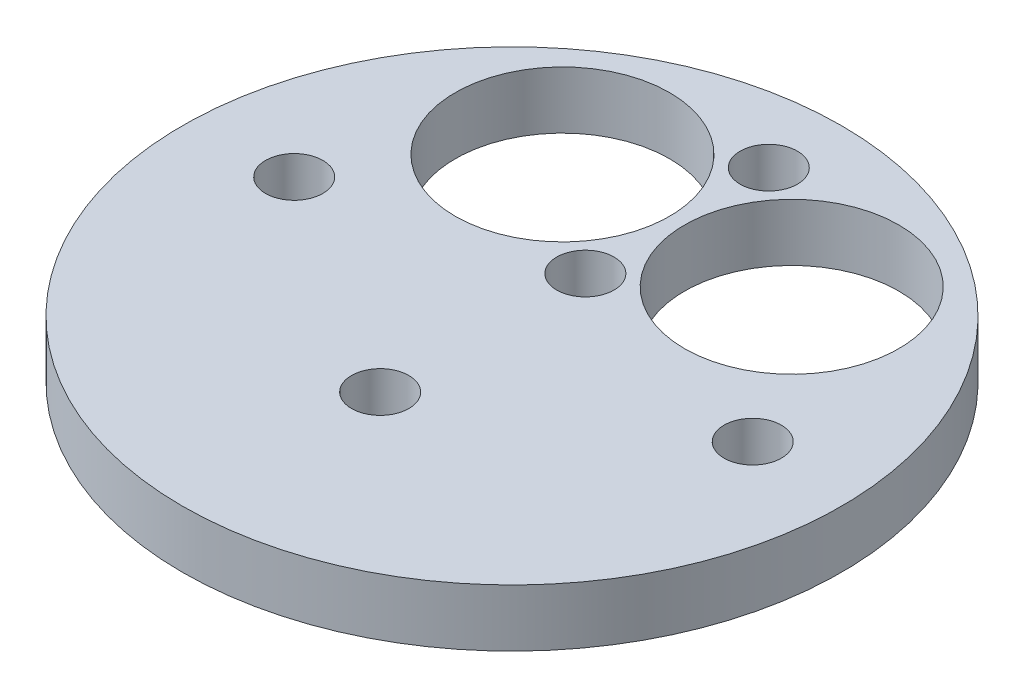
ISO-10303-21;
HEADER;
FILE_DESCRIPTION(('STEP AP214'),'2;1');
FILE_NAME('part.step','',(''),(''),'','','');
FILE_SCHEMA(('AUTOMOTIVE_DESIGN { 1 0 10303 214 1 1 1 1 }'));
ENDSEC;
DATA;
#1=APPLICATION_CONTEXT('core data for automotive mechanical design processes');
#2=APPLICATION_PROTOCOL_DEFINITION('international standard','automotive_design',2000,#1);
#3=PRODUCT_CONTEXT('',#1,'mechanical');
#4=PRODUCT('Part','Part','',(#3));
#5=PRODUCT_RELATED_PRODUCT_CATEGORY('part','',(#4));
#6=PRODUCT_DEFINITION_FORMATION('','',#4);
#7=PRODUCT_DEFINITION_CONTEXT('part definition',#1,'design');
#8=PRODUCT_DEFINITION('design','',#6,#7);
#9=PRODUCT_DEFINITION_SHAPE('','',#8);
#10=(LENGTH_UNIT() NAMED_UNIT(*) SI_UNIT(.MILLI.,.METRE.));
#11=(NAMED_UNIT(*) PLANE_ANGLE_UNIT() SI_UNIT($,.RADIAN.));
#12=(NAMED_UNIT(*) SI_UNIT($,.STERADIAN.) SOLID_ANGLE_UNIT());
#13=UNCERTAINTY_MEASURE_WITH_UNIT(LENGTH_MEASURE(1.E-05),#10,'distance_accuracy_value','');
#14=(GEOMETRIC_REPRESENTATION_CONTEXT(3) GLOBAL_UNCERTAINTY_ASSIGNED_CONTEXT((#13)) GLOBAL_UNIT_ASSIGNED_CONTEXT((#10,
#11,#12)) REPRESENTATION_CONTEXT('',''));
#15=CARTESIAN_POINT('',(0.,0.,0.));
#16=DIRECTION('',(0.,0.,1.));
#17=DIRECTION('',(1.,0.,0.));
#18=AXIS2_PLACEMENT_3D('',#15,#16,#17);
#19=CARTESIAN_POINT('',(0.,0.,0.));
#20=DIRECTION('',(0.,-1.,0.));
#21=DIRECTION('',(0.,0.,-1.));
#22=AXIS2_PLACEMENT_3D('',#19,#20,#21);
#23=PLANE('',#22);
#24=CARTESIAN_POINT('',(-25.4,0.,-1.27));
#25=DIRECTION('',(0.,1.,0.));
#26=DIRECTION('',(0.,0.,1.));
#27=AXIS2_PLACEMENT_3D('',#24,#25,#26);
#28=CIRCLE('',#27,3.175);
#29=CARTESIAN_POINT('',(-25.4,0.,1.905));
#30=VERTEX_POINT('',#29);
#31=EDGE_CURVE('E119',#30,#30,#28,.T.);
#32=ORIENTED_EDGE('',*,*,#31,.T.);
#33=EDGE_LOOP('',(#32));
#34=FACE_BOUND('',#33,.T.);
#35=CARTESIAN_POINT('',(25.4,0.,-1.27));
#36=DIRECTION('',(0.,1.,0.));
#37=DIRECTION('',(0.,0.,1.));
#38=AXIS2_PLACEMENT_3D('',#35,#36,#37);
#39=CIRCLE('',#38,3.175);
#40=CARTESIAN_POINT('',(25.4,0.,1.905));
#41=VERTEX_POINT('',#40);
#42=EDGE_CURVE('E123',#41,#41,#39,.T.);
#43=ORIENTED_EDGE('',*,*,#42,.T.);
#44=EDGE_LOOP('',(#43));
#45=FACE_BOUND('',#44,.T.);
#46=CARTESIAN_POINT('',(0.,0.,-28.448));
#47=DIRECTION('',(0.,1.,0.));
#48=DIRECTION('',(0.,0.,1.));
#49=AXIS2_PLACEMENT_3D('',#46,#47,#48);
#50=CIRCLE('',#49,3.175);
#51=CARTESIAN_POINT('',(0.,0.,-25.273));
#52=VERTEX_POINT('',#51);
#53=EDGE_CURVE('E136',#52,#52,#50,.T.);
#54=ORIENTED_EDGE('',*,*,#53,.T.);
#55=EDGE_LOOP('',(#54));
#56=FACE_BOUND('',#55,.T.);
#57=CARTESIAN_POINT('',(12.7,0.,-18.288));
#58=DIRECTION('',(0.,1.,0.));
#59=DIRECTION('',(0.,0.,1.));
#60=AXIS2_PLACEMENT_3D('',#57,#58,#59);
#61=CIRCLE('',#60,11.8745);
#62=CARTESIAN_POINT('',(12.7,0.,-6.4135));
#63=VERTEX_POINT('',#62);
#64=EDGE_CURVE('E141',#63,#63,#61,.T.);
#65=ORIENTED_EDGE('',*,*,#64,.T.);
#66=EDGE_LOOP('',(#65));
#67=FACE_BOUND('',#66,.T.);
#68=CARTESIAN_POINT('',(0.,0.,-8.128));
#69=DIRECTION('',(0.,1.,0.));
#70=DIRECTION('',(0.,0.,1.));
#71=AXIS2_PLACEMENT_3D('',#68,#69,#70);
#72=CIRCLE('',#71,3.175);
#73=CARTESIAN_POINT('',(0.,0.,-4.953));
#74=VERTEX_POINT('',#73);
#75=EDGE_CURVE('E133',#74,#74,#72,.T.);
#76=ORIENTED_EDGE('',*,*,#75,.T.);
#77=EDGE_LOOP('',(#76));
#78=FACE_BOUND('',#77,.T.);
#79=CARTESIAN_POINT('',(0.,0.,14.605));
#80=DIRECTION('',(0.,1.,0.));
#81=DIRECTION('',(0.,0.,1.));
#82=AXIS2_PLACEMENT_3D('',#79,#80,#81);
#83=CIRCLE('',#82,3.175);
#84=CARTESIAN_POINT('',(0.,0.,17.78));
#85=VERTEX_POINT('',#84);
#86=EDGE_CURVE('E125',#85,#85,#83,.T.);
#87=ORIENTED_EDGE('',*,*,#86,.T.);
#88=EDGE_LOOP('',(#87));
#89=FACE_BOUND('',#88,.T.);
#90=CARTESIAN_POINT('',(-12.7,0.,-18.288));
#91=DIRECTION('',(0.,1.,0.));
#92=DIRECTION('',(0.,0.,1.));
#93=AXIS2_PLACEMENT_3D('',#90,#91,#92);
#94=CIRCLE('',#93,11.8745);
#95=CARTESIAN_POINT('',(-12.7,0.,-6.4135));
#96=VERTEX_POINT('',#95);
#97=EDGE_CURVE('E53',#96,#96,#94,.T.);
#98=ORIENTED_EDGE('',*,*,#97,.T.);
#99=EDGE_LOOP('',(#98));
#100=FACE_BOUND('',#99,.T.);
#101=CARTESIAN_POINT('',(0.,0.,0.));
#102=DIRECTION('',(0.,-1.,0.));
#103=DIRECTION('',(0.,0.,-1.));
#104=AXIS2_PLACEMENT_3D('',#101,#102,#103);
#105=CIRCLE('',#104,36.5125);
#106=CARTESIAN_POINT('',(0.,0.,-36.5125));
#107=VERTEX_POINT('',#106);
#108=EDGE_CURVE('E10',#107,#107,#105,.T.);
#109=ORIENTED_EDGE('',*,*,#108,.T.);
#110=EDGE_LOOP('',(#109));
#111=FACE_BOUND('',#110,.T.);
#112=ADVANCED_FACE('F34',(#34,#45,#56,#67,#78,#89,#100,#111),#23,.T.);
#113=CARTESIAN_POINT('',(0.,0.,0.));
#114=DIRECTION('',(0.,-1.,0.));
#115=DIRECTION('',(0.,0.,-1.));
#116=AXIS2_PLACEMENT_3D('',#113,#114,#115);
#117=CYLINDRICAL_SURFACE('',#116,36.5125);
#118=CARTESIAN_POINT('',(0.,6.35,0.));
#119=DIRECTION('',(0.,-1.,0.));
#120=DIRECTION('',(0.,0.,-1.));
#121=AXIS2_PLACEMENT_3D('',#118,#119,#120);
#122=CIRCLE('',#121,36.5125);
#123=CARTESIAN_POINT('',(0.,6.35,-36.5125));
#124=VERTEX_POINT('',#123);
#125=EDGE_CURVE('E41',#124,#124,#122,.T.);
#126=ORIENTED_EDGE('',*,*,#125,.T.);
#127=EDGE_LOOP('',(#126));
#128=FACE_BOUND('',#127,.T.);
#129=ORIENTED_EDGE('',*,*,#108,.F.);
#130=EDGE_LOOP('',(#129));
#131=FACE_BOUND('',#130,.T.);
#132=ADVANCED_FACE('F72',(#128,#131),#117,.T.);
#133=CARTESIAN_POINT('',(36.5125,6.35,0.));
#134=DIRECTION('',(0.,1.,0.));
#135=DIRECTION('',(0.,0.,1.));
#136=AXIS2_PLACEMENT_3D('',#133,#134,#135);
#137=PLANE('',#136);
#138=CARTESIAN_POINT('',(-25.4,6.35,-1.27));
#139=DIRECTION('',(0.,1.,0.));
#140=DIRECTION('',(0.,0.,1.));
#141=AXIS2_PLACEMENT_3D('',#138,#139,#140);
#142=CIRCLE('',#141,3.175);
#143=CARTESIAN_POINT('',(-25.4,6.35,1.905));
#144=VERTEX_POINT('',#143);
#145=EDGE_CURVE('E122',#144,#144,#142,.T.);
#146=ORIENTED_EDGE('',*,*,#145,.F.);
#147=EDGE_LOOP('',(#146));
#148=FACE_BOUND('',#147,.T.);
#149=CARTESIAN_POINT('',(25.4,6.35,-1.27));
#150=DIRECTION('',(0.,1.,0.));
#151=DIRECTION('',(0.,0.,1.));
#152=AXIS2_PLACEMENT_3D('',#149,#150,#151);
#153=CIRCLE('',#152,3.175);
#154=CARTESIAN_POINT('',(25.4,6.35,1.905));
#155=VERTEX_POINT('',#154);
#156=EDGE_CURVE('E128',#155,#155,#153,.T.);
#157=ORIENTED_EDGE('',*,*,#156,.F.);
#158=EDGE_LOOP('',(#157));
#159=FACE_BOUND('',#158,.T.);
#160=CARTESIAN_POINT('',(0.,6.35,-28.448));
#161=DIRECTION('',(0.,1.,0.));
#162=DIRECTION('',(0.,0.,1.));
#163=AXIS2_PLACEMENT_3D('',#160,#161,#162);
#164=CIRCLE('',#163,3.175);
#165=CARTESIAN_POINT('',(0.,6.35,-25.273));
#166=VERTEX_POINT('',#165);
#167=EDGE_CURVE('E37',#166,#166,#164,.T.);
#168=ORIENTED_EDGE('',*,*,#167,.F.);
#169=EDGE_LOOP('',(#168));
#170=FACE_BOUND('',#169,.T.);
#171=CARTESIAN_POINT('',(12.7,6.35,-18.288));
#172=DIRECTION('',(0.,1.,0.));
#173=DIRECTION('',(0.,0.,1.));
#174=AXIS2_PLACEMENT_3D('',#171,#172,#173);
#175=CIRCLE('',#174,11.8745);
#176=CARTESIAN_POINT('',(12.7,6.35,-6.4135));
#177=VERTEX_POINT('',#176);
#178=EDGE_CURVE('E58',#177,#177,#175,.T.);
#179=ORIENTED_EDGE('',*,*,#178,.F.);
#180=EDGE_LOOP('',(#179));
#181=FACE_BOUND('',#180,.T.);
#182=CARTESIAN_POINT('',(0.,6.35,-8.128));
#183=DIRECTION('',(0.,1.,0.));
#184=DIRECTION('',(0.,0.,1.));
#185=AXIS2_PLACEMENT_3D('',#182,#183,#184);
#186=CIRCLE('',#185,3.175);
#187=CARTESIAN_POINT('',(0.,6.35,-4.953));
#188=VERTEX_POINT('',#187);
#189=EDGE_CURVE('E56',#188,#188,#186,.T.);
#190=ORIENTED_EDGE('',*,*,#189,.F.);
#191=EDGE_LOOP('',(#190));
#192=FACE_BOUND('',#191,.T.);
#193=CARTESIAN_POINT('',(0.,6.35,14.605));
#194=DIRECTION('',(0.,1.,0.));
#195=DIRECTION('',(0.,0.,1.));
#196=AXIS2_PLACEMENT_3D('',#193,#194,#195);
#197=CIRCLE('',#196,3.175);
#198=CARTESIAN_POINT('',(0.,6.35,17.78));
#199=VERTEX_POINT('',#198);
#200=EDGE_CURVE('E52',#199,#199,#197,.T.);
#201=ORIENTED_EDGE('',*,*,#200,.F.);
#202=EDGE_LOOP('',(#201));
#203=FACE_BOUND('',#202,.T.);
#204=CARTESIAN_POINT('',(-12.7,6.35,-18.288));
#205=DIRECTION('',(0.,1.,0.));
#206=DIRECTION('',(0.,0.,1.));
#207=AXIS2_PLACEMENT_3D('',#204,#205,#206);
#208=CIRCLE('',#207,11.8745);
#209=CARTESIAN_POINT('',(-12.7,6.35,-6.4135));
#210=VERTEX_POINT('',#209);
#211=EDGE_CURVE('E49',#210,#210,#208,.T.);
#212=ORIENTED_EDGE('',*,*,#211,.F.);
#213=EDGE_LOOP('',(#212));
#214=FACE_BOUND('',#213,.T.);
#215=ORIENTED_EDGE('',*,*,#125,.F.);
#216=EDGE_LOOP('',(#215));
#217=FACE_BOUND('',#216,.T.);
#218=ADVANCED_FACE('F68',(#148,#159,#170,#181,#192,#203,#214,#217),#137,.T.);
#219=CARTESIAN_POINT('',(-12.7,0.,-18.288));
#220=DIRECTION('',(0.,1.,0.));
#221=DIRECTION('',(0.,0.,1.));
#222=AXIS2_PLACEMENT_3D('',#219,#220,#221);
#223=CYLINDRICAL_SURFACE('',#222,11.8745);
#224=CARTESIAN_POINT('',(-12.7,6.35,-6.4135));
#225=CARTESIAN_POINT('',(-12.7,6.28385416666666,-6.4135));
#226=CARTESIAN_POINT('',(-12.7,6.21770833333333,-6.4135));
#227=CARTESIAN_POINT('',(-12.7,6.08541666666666,-6.4135));
#228=CARTESIAN_POINT('',(-12.7,6.01927083333333,-6.4135));
#229=CARTESIAN_POINT('',(-12.7,5.88697916666666,-6.4135));
#230=CARTESIAN_POINT('',(-12.7,5.82083333333333,-6.4135));
#231=CARTESIAN_POINT('',(-12.7,5.68854166666666,-6.4135));
#232=CARTESIAN_POINT('',(-12.7,5.62239583333333,-6.4135));
#233=CARTESIAN_POINT('',(-12.7,5.49010416666666,-6.4135));
#234=CARTESIAN_POINT('',(-12.7,5.42395833333333,-6.4135));
#235=CARTESIAN_POINT('',(-12.7,5.29166666666666,-6.4135));
#236=CARTESIAN_POINT('',(-12.7,5.22552083333333,-6.4135));
#237=CARTESIAN_POINT('',(-12.7,5.09322916666666,-6.4135));
#238=CARTESIAN_POINT('',(-12.7,5.02708333333333,-6.4135));
#239=CARTESIAN_POINT('',(-12.7,4.89479166666666,-6.4135));
#240=CARTESIAN_POINT('',(-12.7,4.82864583333333,-6.4135));
#241=CARTESIAN_POINT('',(-12.7,4.69635416666666,-6.4135));
#242=CARTESIAN_POINT('',(-12.7,4.63020833333333,-6.4135));
#243=CARTESIAN_POINT('',(-12.7,4.49791666666667,-6.4135));
#244=CARTESIAN_POINT('',(-12.7,4.43177083333333,-6.4135));
#245=CARTESIAN_POINT('',(-12.7,4.29947916666667,-6.4135));
#246=CARTESIAN_POINT('',(-12.7,4.23333333333333,-6.4135));
#247=CARTESIAN_POINT('',(-12.7,4.10104166666666,-6.4135));
#248=CARTESIAN_POINT('',(-12.7,4.03489583333333,-6.4135));
#249=CARTESIAN_POINT('',(-12.7,3.90260416666666,-6.4135));
#250=CARTESIAN_POINT('',(-12.7,3.83645833333333,-6.4135));
#251=CARTESIAN_POINT('',(-12.7,3.70416666666667,-6.4135));
#252=CARTESIAN_POINT('',(-12.7,3.63802083333333,-6.4135));
#253=CARTESIAN_POINT('',(-12.7,3.50572916666667,-6.4135));
#254=CARTESIAN_POINT('',(-12.7,3.43958333333333,-6.4135));
#255=CARTESIAN_POINT('',(-12.7,3.30729166666667,-6.4135));
#256=CARTESIAN_POINT('',(-12.7,3.24114583333333,-6.4135));
#257=CARTESIAN_POINT('',(-12.7,3.10885416666667,-6.4135));
#258=CARTESIAN_POINT('',(-12.7,3.04270833333333,-6.4135));
#259=CARTESIAN_POINT('',(-12.7,2.91041666666667,-6.4135));
#260=CARTESIAN_POINT('',(-12.7,2.84427083333333,-6.4135));
#261=CARTESIAN_POINT('',(-12.7,2.71197916666667,-6.4135));
#262=CARTESIAN_POINT('',(-12.7,2.64583333333333,-6.4135));
#263=CARTESIAN_POINT('',(-12.7,2.51354166666667,-6.4135));
#264=CARTESIAN_POINT('',(-12.7,2.44739583333333,-6.4135));
#265=CARTESIAN_POINT('',(-12.7,2.31510416666667,-6.4135));
#266=CARTESIAN_POINT('',(-12.7,2.24895833333333,-6.4135));
#267=CARTESIAN_POINT('',(-12.7,2.11666666666666,-6.4135));
#268=CARTESIAN_POINT('',(-12.7,2.05052083333333,-6.4135));
#269=CARTESIAN_POINT('',(-12.7,1.91822916666667,-6.4135));
#270=CARTESIAN_POINT('',(-12.7,1.85208333333333,-6.4135));
#271=CARTESIAN_POINT('',(-12.7,1.71979166666667,-6.4135));
#272=CARTESIAN_POINT('',(-12.7,1.65364583333333,-6.4135));
#273=CARTESIAN_POINT('',(-12.7,1.52135416666667,-6.4135));
#274=CARTESIAN_POINT('',(-12.7,1.45520833333333,-6.4135));
#275=CARTESIAN_POINT('',(-12.7,1.32291666666667,-6.4135));
#276=CARTESIAN_POINT('',(-12.7,1.25677083333333,-6.4135));
#277=CARTESIAN_POINT('',(-12.7,1.12447916666667,-6.4135));
#278=CARTESIAN_POINT('',(-12.7,1.05833333333333,-6.4135));
#279=CARTESIAN_POINT('',(-12.7,0.926041666666666,-6.4135));
#280=CARTESIAN_POINT('',(-12.7,0.859895833333333,-6.4135));
#281=CARTESIAN_POINT('',(-12.7,0.727604166666666,-6.4135));
#282=CARTESIAN_POINT('',(-12.7,0.661458333333333,-6.4135));
#283=CARTESIAN_POINT('',(-12.7,0.529166666666666,-6.4135));
#284=CARTESIAN_POINT('',(-12.7,0.463020833333333,-6.4135));
#285=CARTESIAN_POINT('',(-12.7,0.330729166666666,-6.4135));
#286=CARTESIAN_POINT('',(-12.7,0.264583333333333,-6.4135));
#287=CARTESIAN_POINT('',(-12.7,0.132291666666667,-6.4135));
#288=CARTESIAN_POINT('',(-12.7,0.0661458333333333,-6.4135));
#289=CARTESIAN_POINT('',(-12.7,0.,-6.4135));
#290=B_SPLINE_CURVE_WITH_KNOTS('',3,(#224,#225,#226,#227,#228,#229,#230,#231,#232,#233,#234,
#235,#236,#237,#238,#239,#240,#241,#242,#243,#244,#245,#246,#247,#248,#249,#250,#251,#252,#253,
#254,#255,#256,#257,#258,#259,#260,#261,#262,#263,#264,#265,#266,#267,#268,#269,#270,#271,#272,
#273,#274,#275,#276,#277,#278,#279,#280,#281,#282,#283,#284,#285,#286,#287,#288,#289),
.UNSPECIFIED.,.F.,.F.,(4,2,2,2,2,2,2,2,2,2,2,2,2,2,2,2,2,2,2,2,2,2,2,2,2,2,2,2,2,2,2,2,4),(0.,
0.1984375,0.396875,0.595312499999999,0.793749999999999,0.9921875,1.190625,1.3890625,1.5875,
1.7859375,1.984375,2.1828125,2.38125,2.5796875,2.778125,2.9765625,3.175,3.3734375,3.571875,
3.7703125,3.96875,4.1671875,4.365625,4.5640625,4.7625,4.9609375,5.159375,5.3578125,5.55625,
5.7546875,5.953125,6.1515625,6.35),.UNSPECIFIED.);
#291=EDGE_CURVE('BSEAM71',#210,#96,#290,.T.);
#292=ORIENTED_EDGE('',*,*,#211,.T.);
#293=ORIENTED_EDGE('',*,*,#97,.F.);
#294=ORIENTED_EDGE('',*,*,#291,.T.);
#295=ORIENTED_EDGE('',*,*,#291,.F.);
#296=EDGE_LOOP('',(#292,#294,#293,#295));
#297=FACE_BOUND('',#296,.T.);
#298=ADVANCED_FACE('F71',(#297),#223,.F.);
#299=CARTESIAN_POINT('',(0.,0.,14.605));
#300=DIRECTION('',(0.,1.,0.));
#301=DIRECTION('',(0.,0.,1.));
#302=AXIS2_PLACEMENT_3D('',#299,#300,#301);
#303=CYLINDRICAL_SURFACE('',#302,3.175);
#304=CARTESIAN_POINT('',(0.,6.35,17.78));
#305=CARTESIAN_POINT('',(0.,6.28385416666666,17.78));
#306=CARTESIAN_POINT('',(0.,6.21770833333333,17.78));
#307=CARTESIAN_POINT('',(0.,6.08541666666666,17.78));
#308=CARTESIAN_POINT('',(0.,6.01927083333333,17.78));
#309=CARTESIAN_POINT('',(0.,5.88697916666666,17.78));
#310=CARTESIAN_POINT('',(0.,5.82083333333333,17.78));
#311=CARTESIAN_POINT('',(0.,5.68854166666666,17.78));
#312=CARTESIAN_POINT('',(0.,5.62239583333333,17.78));
#313=CARTESIAN_POINT('',(0.,5.49010416666666,17.78));
#314=CARTESIAN_POINT('',(0.,5.42395833333333,17.78));
#315=CARTESIAN_POINT('',(0.,5.29166666666666,17.78));
#316=CARTESIAN_POINT('',(0.,5.22552083333333,17.78));
#317=CARTESIAN_POINT('',(0.,5.09322916666666,17.78));
#318=CARTESIAN_POINT('',(0.,5.02708333333333,17.78));
#319=CARTESIAN_POINT('',(0.,4.89479166666666,17.78));
#320=CARTESIAN_POINT('',(0.,4.82864583333333,17.78));
#321=CARTESIAN_POINT('',(0.,4.69635416666666,17.78));
#322=CARTESIAN_POINT('',(0.,4.63020833333333,17.78));
#323=CARTESIAN_POINT('',(0.,4.49791666666667,17.78));
#324=CARTESIAN_POINT('',(0.,4.43177083333333,17.78));
#325=CARTESIAN_POINT('',(0.,4.29947916666667,17.78));
#326=CARTESIAN_POINT('',(0.,4.23333333333333,17.78));
#327=CARTESIAN_POINT('',(0.,4.10104166666666,17.78));
#328=CARTESIAN_POINT('',(0.,4.03489583333333,17.78));
#329=CARTESIAN_POINT('',(0.,3.90260416666666,17.78));
#330=CARTESIAN_POINT('',(0.,3.83645833333333,17.78));
#331=CARTESIAN_POINT('',(0.,3.70416666666667,17.78));
#332=CARTESIAN_POINT('',(0.,3.63802083333333,17.78));
#333=CARTESIAN_POINT('',(0.,3.50572916666667,17.78));
#334=CARTESIAN_POINT('',(0.,3.43958333333333,17.78));
#335=CARTESIAN_POINT('',(0.,3.30729166666667,17.78));
#336=CARTESIAN_POINT('',(0.,3.24114583333333,17.78));
#337=CARTESIAN_POINT('',(0.,3.10885416666667,17.78));
#338=CARTESIAN_POINT('',(0.,3.04270833333333,17.78));
#339=CARTESIAN_POINT('',(0.,2.91041666666667,17.78));
#340=CARTESIAN_POINT('',(0.,2.84427083333333,17.78));
#341=CARTESIAN_POINT('',(0.,2.71197916666667,17.78));
#342=CARTESIAN_POINT('',(0.,2.64583333333333,17.78));
#343=CARTESIAN_POINT('',(0.,2.51354166666667,17.78));
#344=CARTESIAN_POINT('',(0.,2.44739583333333,17.78));
#345=CARTESIAN_POINT('',(0.,2.31510416666667,17.78));
#346=CARTESIAN_POINT('',(0.,2.24895833333333,17.78));
#347=CARTESIAN_POINT('',(0.,2.11666666666666,17.78));
#348=CARTESIAN_POINT('',(0.,2.05052083333333,17.78));
#349=CARTESIAN_POINT('',(0.,1.91822916666667,17.78));
#350=CARTESIAN_POINT('',(0.,1.85208333333333,17.78));
#351=CARTESIAN_POINT('',(0.,1.71979166666667,17.78));
#352=CARTESIAN_POINT('',(0.,1.65364583333333,17.78));
#353=CARTESIAN_POINT('',(0.,1.52135416666667,17.78));
#354=CARTESIAN_POINT('',(0.,1.45520833333333,17.78));
#355=CARTESIAN_POINT('',(0.,1.32291666666667,17.78));
#356=CARTESIAN_POINT('',(0.,1.25677083333333,17.78));
#357=CARTESIAN_POINT('',(0.,1.12447916666667,17.78));
#358=CARTESIAN_POINT('',(0.,1.05833333333333,17.78));
#359=CARTESIAN_POINT('',(0.,0.926041666666666,17.78));
#360=CARTESIAN_POINT('',(0.,0.859895833333333,17.78));
#361=CARTESIAN_POINT('',(0.,0.727604166666666,17.78));
#362=CARTESIAN_POINT('',(0.,0.661458333333333,17.78));
#363=CARTESIAN_POINT('',(0.,0.529166666666666,17.78));
#364=CARTESIAN_POINT('',(0.,0.463020833333333,17.78));
#365=CARTESIAN_POINT('',(0.,0.330729166666666,17.78));
#366=CARTESIAN_POINT('',(0.,0.264583333333333,17.78));
#367=CARTESIAN_POINT('',(0.,0.132291666666667,17.78));
#368=CARTESIAN_POINT('',(0.,0.0661458333333333,17.78));
#369=CARTESIAN_POINT('',(0.,0.,17.78));
#370=B_SPLINE_CURVE_WITH_KNOTS('',3,(#304,#305,#306,#307,#308,#309,#310,#311,#312,#313,#314,
#315,#316,#317,#318,#319,#320,#321,#322,#323,#324,#325,#326,#327,#328,#329,#330,#331,#332,#333,
#334,#335,#336,#337,#338,#339,#340,#341,#342,#343,#344,#345,#346,#347,#348,#349,#350,#351,#352,
#353,#354,#355,#356,#357,#358,#359,#360,#361,#362,#363,#364,#365,#366,#367,#368,#369),
.UNSPECIFIED.,.F.,.F.,(4,2,2,2,2,2,2,2,2,2,2,2,2,2,2,2,2,2,2,2,2,2,2,2,2,2,2,2,2,2,2,2,4),(0.,
0.1984375,0.396875,0.595312499999999,0.793749999999999,0.9921875,1.190625,1.3890625,1.5875,
1.7859375,1.984375,2.1828125,2.38125,2.5796875,2.778125,2.9765625,3.175,3.3734375,3.571875,
3.7703125,3.96875,4.1671875,4.365625,4.5640625,4.7625,4.9609375,5.159375,5.3578125,5.55625,
5.7546875,5.953125,6.1515625,6.35),.UNSPECIFIED.);
#371=EDGE_CURVE('BSEAM93',#199,#85,#370,.T.);
#372=ORIENTED_EDGE('',*,*,#200,.T.);
#373=ORIENTED_EDGE('',*,*,#86,.F.);
#374=ORIENTED_EDGE('',*,*,#371,.T.);
#375=ORIENTED_EDGE('',*,*,#371,.F.);
#376=EDGE_LOOP('',(#372,#374,#373,#375));
#377=FACE_BOUND('',#376,.T.);
#378=ADVANCED_FACE('F93',(#377),#303,.F.);
#379=CARTESIAN_POINT('',(0.,0.,-8.128));
#380=DIRECTION('',(0.,1.,0.));
#381=DIRECTION('',(0.,0.,1.));
#382=AXIS2_PLACEMENT_3D('',#379,#380,#381);
#383=CYLINDRICAL_SURFACE('',#382,3.175);
#384=CARTESIAN_POINT('',(0.,6.35,-4.953));
#385=CARTESIAN_POINT('',(0.,6.28385416666666,-4.953));
#386=CARTESIAN_POINT('',(0.,6.21770833333333,-4.953));
#387=CARTESIAN_POINT('',(0.,6.08541666666666,-4.953));
#388=CARTESIAN_POINT('',(0.,6.01927083333333,-4.953));
#389=CARTESIAN_POINT('',(0.,5.88697916666666,-4.953));
#390=CARTESIAN_POINT('',(0.,5.82083333333333,-4.953));
#391=CARTESIAN_POINT('',(0.,5.68854166666666,-4.953));
#392=CARTESIAN_POINT('',(0.,5.62239583333333,-4.953));
#393=CARTESIAN_POINT('',(0.,5.49010416666666,-4.953));
#394=CARTESIAN_POINT('',(0.,5.42395833333333,-4.953));
#395=CARTESIAN_POINT('',(0.,5.29166666666666,-4.953));
#396=CARTESIAN_POINT('',(0.,5.22552083333333,-4.953));
#397=CARTESIAN_POINT('',(0.,5.09322916666666,-4.953));
#398=CARTESIAN_POINT('',(0.,5.02708333333333,-4.953));
#399=CARTESIAN_POINT('',(0.,4.89479166666666,-4.953));
#400=CARTESIAN_POINT('',(0.,4.82864583333333,-4.953));
#401=CARTESIAN_POINT('',(0.,4.69635416666666,-4.953));
#402=CARTESIAN_POINT('',(0.,4.63020833333333,-4.953));
#403=CARTESIAN_POINT('',(0.,4.49791666666667,-4.953));
#404=CARTESIAN_POINT('',(0.,4.43177083333333,-4.953));
#405=CARTESIAN_POINT('',(0.,4.29947916666667,-4.953));
#406=CARTESIAN_POINT('',(0.,4.23333333333333,-4.953));
#407=CARTESIAN_POINT('',(0.,4.10104166666666,-4.953));
#408=CARTESIAN_POINT('',(0.,4.03489583333333,-4.953));
#409=CARTESIAN_POINT('',(0.,3.90260416666666,-4.953));
#410=CARTESIAN_POINT('',(0.,3.83645833333333,-4.953));
#411=CARTESIAN_POINT('',(0.,3.70416666666667,-4.953));
#412=CARTESIAN_POINT('',(0.,3.63802083333333,-4.953));
#413=CARTESIAN_POINT('',(0.,3.50572916666667,-4.953));
#414=CARTESIAN_POINT('',(0.,3.43958333333333,-4.953));
#415=CARTESIAN_POINT('',(0.,3.30729166666667,-4.953));
#416=CARTESIAN_POINT('',(0.,3.24114583333333,-4.953));
#417=CARTESIAN_POINT('',(0.,3.10885416666667,-4.953));
#418=CARTESIAN_POINT('',(0.,3.04270833333333,-4.953));
#419=CARTESIAN_POINT('',(0.,2.91041666666667,-4.953));
#420=CARTESIAN_POINT('',(0.,2.84427083333333,-4.953));
#421=CARTESIAN_POINT('',(0.,2.71197916666667,-4.953));
#422=CARTESIAN_POINT('',(0.,2.64583333333333,-4.953));
#423=CARTESIAN_POINT('',(0.,2.51354166666667,-4.953));
#424=CARTESIAN_POINT('',(0.,2.44739583333333,-4.953));
#425=CARTESIAN_POINT('',(0.,2.31510416666667,-4.953));
#426=CARTESIAN_POINT('',(0.,2.24895833333333,-4.953));
#427=CARTESIAN_POINT('',(0.,2.11666666666666,-4.953));
#428=CARTESIAN_POINT('',(0.,2.05052083333333,-4.953));
#429=CARTESIAN_POINT('',(0.,1.91822916666667,-4.953));
#430=CARTESIAN_POINT('',(0.,1.85208333333333,-4.953));
#431=CARTESIAN_POINT('',(0.,1.71979166666667,-4.953));
#432=CARTESIAN_POINT('',(0.,1.65364583333333,-4.953));
#433=CARTESIAN_POINT('',(0.,1.52135416666667,-4.953));
#434=CARTESIAN_POINT('',(0.,1.45520833333333,-4.953));
#435=CARTESIAN_POINT('',(0.,1.32291666666667,-4.953));
#436=CARTESIAN_POINT('',(0.,1.25677083333333,-4.953));
#437=CARTESIAN_POINT('',(0.,1.12447916666667,-4.953));
#438=CARTESIAN_POINT('',(0.,1.05833333333333,-4.953));
#439=CARTESIAN_POINT('',(0.,0.926041666666666,-4.953));
#440=CARTESIAN_POINT('',(0.,0.859895833333333,-4.953));
#441=CARTESIAN_POINT('',(0.,0.727604166666666,-4.953));
#442=CARTESIAN_POINT('',(0.,0.661458333333333,-4.953));
#443=CARTESIAN_POINT('',(0.,0.529166666666666,-4.953));
#444=CARTESIAN_POINT('',(0.,0.463020833333333,-4.953));
#445=CARTESIAN_POINT('',(0.,0.330729166666666,-4.953));
#446=CARTESIAN_POINT('',(0.,0.264583333333333,-4.953));
#447=CARTESIAN_POINT('',(0.,0.132291666666667,-4.953));
#448=CARTESIAN_POINT('',(0.,0.0661458333333333,-4.953));
#449=CARTESIAN_POINT('',(0.,0.,-4.953));
#450=B_SPLINE_CURVE_WITH_KNOTS('',3,(#384,#385,#386,#387,#388,#389,#390,#391,#392,#393,#394,
#395,#396,#397,#398,#399,#400,#401,#402,#403,#404,#405,#406,#407,#408,#409,#410,#411,#412,#413,
#414,#415,#416,#417,#418,#419,#420,#421,#422,#423,#424,#425,#426,#427,#428,#429,#430,#431,#432,
#433,#434,#435,#436,#437,#438,#439,#440,#441,#442,#443,#444,#445,#446,#447,#448,#449),
.UNSPECIFIED.,.F.,.F.,(4,2,2,2,2,2,2,2,2,2,2,2,2,2,2,2,2,2,2,2,2,2,2,2,2,2,2,2,2,2,2,2,4),(0.,
0.1984375,0.396875,0.595312499999999,0.793749999999999,0.9921875,1.190625,1.3890625,1.5875,
1.7859375,1.984375,2.1828125,2.38125,2.5796875,2.778125,2.9765625,3.175,3.3734375,3.571875,
3.7703125,3.96875,4.1671875,4.365625,4.5640625,4.7625,4.9609375,5.159375,5.3578125,5.55625,
5.7546875,5.953125,6.1515625,6.35),.UNSPECIFIED.);
#451=EDGE_CURVE('BSEAM98',#188,#74,#450,.T.);
#452=ORIENTED_EDGE('',*,*,#189,.T.);
#453=ORIENTED_EDGE('',*,*,#75,.F.);
#454=ORIENTED_EDGE('',*,*,#451,.T.);
#455=ORIENTED_EDGE('',*,*,#451,.F.);
#456=EDGE_LOOP('',(#452,#454,#453,#455));
#457=FACE_BOUND('',#456,.T.);
#458=ADVANCED_FACE('F98',(#457),#383,.F.);
#459=CARTESIAN_POINT('',(12.7,0.,-18.288));
#460=DIRECTION('',(0.,1.,0.));
#461=DIRECTION('',(0.,0.,1.));
#462=AXIS2_PLACEMENT_3D('',#459,#460,#461);
#463=CYLINDRICAL_SURFACE('',#462,11.8745);
#464=CARTESIAN_POINT('',(12.7,6.35,-6.4135));
#465=CARTESIAN_POINT('',(12.7,6.28385416666666,-6.4135));
#466=CARTESIAN_POINT('',(12.7,6.21770833333333,-6.4135));
#467=CARTESIAN_POINT('',(12.7,6.08541666666666,-6.4135));
#468=CARTESIAN_POINT('',(12.7,6.01927083333333,-6.4135));
#469=CARTESIAN_POINT('',(12.7,5.88697916666666,-6.4135));
#470=CARTESIAN_POINT('',(12.7,5.82083333333333,-6.4135));
#471=CARTESIAN_POINT('',(12.7,5.68854166666666,-6.4135));
#472=CARTESIAN_POINT('',(12.7,5.62239583333333,-6.4135));
#473=CARTESIAN_POINT('',(12.7,5.49010416666666,-6.4135));
#474=CARTESIAN_POINT('',(12.7,5.42395833333333,-6.4135));
#475=CARTESIAN_POINT('',(12.7,5.29166666666666,-6.4135));
#476=CARTESIAN_POINT('',(12.7,5.22552083333333,-6.4135));
#477=CARTESIAN_POINT('',(12.7,5.09322916666666,-6.4135));
#478=CARTESIAN_POINT('',(12.7,5.02708333333333,-6.4135));
#479=CARTESIAN_POINT('',(12.7,4.89479166666666,-6.4135));
#480=CARTESIAN_POINT('',(12.7,4.82864583333333,-6.4135));
#481=CARTESIAN_POINT('',(12.7,4.69635416666666,-6.4135));
#482=CARTESIAN_POINT('',(12.7,4.63020833333333,-6.4135));
#483=CARTESIAN_POINT('',(12.7,4.49791666666667,-6.4135));
#484=CARTESIAN_POINT('',(12.7,4.43177083333333,-6.4135));
#485=CARTESIAN_POINT('',(12.7,4.29947916666667,-6.4135));
#486=CARTESIAN_POINT('',(12.7,4.23333333333333,-6.4135));
#487=CARTESIAN_POINT('',(12.7,4.10104166666666,-6.4135));
#488=CARTESIAN_POINT('',(12.7,4.03489583333333,-6.4135));
#489=CARTESIAN_POINT('',(12.7,3.90260416666666,-6.4135));
#490=CARTESIAN_POINT('',(12.7,3.83645833333333,-6.4135));
#491=CARTESIAN_POINT('',(12.7,3.70416666666667,-6.4135));
#492=CARTESIAN_POINT('',(12.7,3.63802083333333,-6.4135));
#493=CARTESIAN_POINT('',(12.7,3.50572916666667,-6.4135));
#494=CARTESIAN_POINT('',(12.7,3.43958333333333,-6.4135));
#495=CARTESIAN_POINT('',(12.7,3.30729166666667,-6.4135));
#496=CARTESIAN_POINT('',(12.7,3.24114583333333,-6.4135));
#497=CARTESIAN_POINT('',(12.7,3.10885416666667,-6.4135));
#498=CARTESIAN_POINT('',(12.7,3.04270833333333,-6.4135));
#499=CARTESIAN_POINT('',(12.7,2.91041666666667,-6.4135));
#500=CARTESIAN_POINT('',(12.7,2.84427083333333,-6.4135));
#501=CARTESIAN_POINT('',(12.7,2.71197916666667,-6.4135));
#502=CARTESIAN_POINT('',(12.7,2.64583333333333,-6.4135));
#503=CARTESIAN_POINT('',(12.7,2.51354166666667,-6.4135));
#504=CARTESIAN_POINT('',(12.7,2.44739583333333,-6.4135));
#505=CARTESIAN_POINT('',(12.7,2.31510416666667,-6.4135));
#506=CARTESIAN_POINT('',(12.7,2.24895833333333,-6.4135));
#507=CARTESIAN_POINT('',(12.7,2.11666666666666,-6.4135));
#508=CARTESIAN_POINT('',(12.7,2.05052083333333,-6.4135));
#509=CARTESIAN_POINT('',(12.7,1.91822916666667,-6.4135));
#510=CARTESIAN_POINT('',(12.7,1.85208333333333,-6.4135));
#511=CARTESIAN_POINT('',(12.7,1.71979166666667,-6.4135));
#512=CARTESIAN_POINT('',(12.7,1.65364583333333,-6.4135));
#513=CARTESIAN_POINT('',(12.7,1.52135416666667,-6.4135));
#514=CARTESIAN_POINT('',(12.7,1.45520833333333,-6.4135));
#515=CARTESIAN_POINT('',(12.7,1.32291666666667,-6.4135));
#516=CARTESIAN_POINT('',(12.7,1.25677083333333,-6.4135));
#517=CARTESIAN_POINT('',(12.7,1.12447916666667,-6.4135));
#518=CARTESIAN_POINT('',(12.7,1.05833333333333,-6.4135));
#519=CARTESIAN_POINT('',(12.7,0.926041666666666,-6.4135));
#520=CARTESIAN_POINT('',(12.7,0.859895833333333,-6.4135));
#521=CARTESIAN_POINT('',(12.7,0.727604166666666,-6.4135));
#522=CARTESIAN_POINT('',(12.7,0.661458333333333,-6.4135));
#523=CARTESIAN_POINT('',(12.7,0.529166666666666,-6.4135));
#524=CARTESIAN_POINT('',(12.7,0.463020833333333,-6.4135));
#525=CARTESIAN_POINT('',(12.7,0.330729166666666,-6.4135));
#526=CARTESIAN_POINT('',(12.7,0.264583333333333,-6.4135));
#527=CARTESIAN_POINT('',(12.7,0.132291666666667,-6.4135));
#528=CARTESIAN_POINT('',(12.7,0.0661458333333333,-6.4135));
#529=CARTESIAN_POINT('',(12.7,0.,-6.4135));
#530=B_SPLINE_CURVE_WITH_KNOTS('',3,(#464,#465,#466,#467,#468,#469,#470,#471,#472,#473,#474,
#475,#476,#477,#478,#479,#480,#481,#482,#483,#484,#485,#486,#487,#488,#489,#490,#491,#492,#493,
#494,#495,#496,#497,#498,#499,#500,#501,#502,#503,#504,#505,#506,#507,#508,#509,#510,#511,#512,
#513,#514,#515,#516,#517,#518,#519,#520,#521,#522,#523,#524,#525,#526,#527,#528,#529),
.UNSPECIFIED.,.F.,.F.,(4,2,2,2,2,2,2,2,2,2,2,2,2,2,2,2,2,2,2,2,2,2,2,2,2,2,2,2,2,2,2,2,4),(0.,
0.1984375,0.396875,0.595312499999999,0.793749999999999,0.9921875,1.190625,1.3890625,1.5875,
1.7859375,1.984375,2.1828125,2.38125,2.5796875,2.778125,2.9765625,3.175,3.3734375,3.571875,
3.7703125,3.96875,4.1671875,4.365625,4.5640625,4.7625,4.9609375,5.159375,5.3578125,5.55625,
5.7546875,5.953125,6.1515625,6.35),.UNSPECIFIED.);
#531=EDGE_CURVE('BSEAM95',#177,#63,#530,.T.);
#532=ORIENTED_EDGE('',*,*,#178,.T.);
#533=ORIENTED_EDGE('',*,*,#64,.F.);
#534=ORIENTED_EDGE('',*,*,#531,.T.);
#535=ORIENTED_EDGE('',*,*,#531,.F.);
#536=EDGE_LOOP('',(#532,#534,#533,#535));
#537=FACE_BOUND('',#536,.T.);
#538=ADVANCED_FACE('F95',(#537),#463,.F.);
#539=CARTESIAN_POINT('',(0.,0.,-28.448));
#540=DIRECTION('',(0.,1.,0.));
#541=DIRECTION('',(0.,0.,1.));
#542=AXIS2_PLACEMENT_3D('',#539,#540,#541);
#543=CYLINDRICAL_SURFACE('',#542,3.175);
#544=CARTESIAN_POINT('',(0.,6.35,-25.273));
#545=CARTESIAN_POINT('',(0.,6.28385416666666,-25.273));
#546=CARTESIAN_POINT('',(0.,6.21770833333333,-25.273));
#547=CARTESIAN_POINT('',(0.,6.08541666666666,-25.273));
#548=CARTESIAN_POINT('',(0.,6.01927083333333,-25.273));
#549=CARTESIAN_POINT('',(0.,5.88697916666666,-25.273));
#550=CARTESIAN_POINT('',(0.,5.82083333333333,-25.273));
#551=CARTESIAN_POINT('',(0.,5.68854166666666,-25.273));
#552=CARTESIAN_POINT('',(0.,5.62239583333333,-25.273));
#553=CARTESIAN_POINT('',(0.,5.49010416666666,-25.273));
#554=CARTESIAN_POINT('',(0.,5.42395833333333,-25.273));
#555=CARTESIAN_POINT('',(0.,5.29166666666666,-25.273));
#556=CARTESIAN_POINT('',(0.,5.22552083333333,-25.273));
#557=CARTESIAN_POINT('',(0.,5.09322916666666,-25.273));
#558=CARTESIAN_POINT('',(0.,5.02708333333333,-25.273));
#559=CARTESIAN_POINT('',(0.,4.89479166666666,-25.273));
#560=CARTESIAN_POINT('',(0.,4.82864583333333,-25.273));
#561=CARTESIAN_POINT('',(0.,4.69635416666666,-25.273));
#562=CARTESIAN_POINT('',(0.,4.63020833333333,-25.273));
#563=CARTESIAN_POINT('',(0.,4.49791666666667,-25.273));
#564=CARTESIAN_POINT('',(0.,4.43177083333333,-25.273));
#565=CARTESIAN_POINT('',(0.,4.29947916666667,-25.273));
#566=CARTESIAN_POINT('',(0.,4.23333333333333,-25.273));
#567=CARTESIAN_POINT('',(0.,4.10104166666666,-25.273));
#568=CARTESIAN_POINT('',(0.,4.03489583333333,-25.273));
#569=CARTESIAN_POINT('',(0.,3.90260416666666,-25.273));
#570=CARTESIAN_POINT('',(0.,3.83645833333333,-25.273));
#571=CARTESIAN_POINT('',(0.,3.70416666666667,-25.273));
#572=CARTESIAN_POINT('',(0.,3.63802083333333,-25.273));
#573=CARTESIAN_POINT('',(0.,3.50572916666667,-25.273));
#574=CARTESIAN_POINT('',(0.,3.43958333333333,-25.273));
#575=CARTESIAN_POINT('',(0.,3.30729166666667,-25.273));
#576=CARTESIAN_POINT('',(0.,3.24114583333333,-25.273));
#577=CARTESIAN_POINT('',(0.,3.10885416666667,-25.273));
#578=CARTESIAN_POINT('',(0.,3.04270833333333,-25.273));
#579=CARTESIAN_POINT('',(0.,2.91041666666667,-25.273));
#580=CARTESIAN_POINT('',(0.,2.84427083333333,-25.273));
#581=CARTESIAN_POINT('',(0.,2.71197916666667,-25.273));
#582=CARTESIAN_POINT('',(0.,2.64583333333333,-25.273));
#583=CARTESIAN_POINT('',(0.,2.51354166666667,-25.273));
#584=CARTESIAN_POINT('',(0.,2.44739583333333,-25.273));
#585=CARTESIAN_POINT('',(0.,2.31510416666667,-25.273));
#586=CARTESIAN_POINT('',(0.,2.24895833333333,-25.273));
#587=CARTESIAN_POINT('',(0.,2.11666666666666,-25.273));
#588=CARTESIAN_POINT('',(0.,2.05052083333333,-25.273));
#589=CARTESIAN_POINT('',(0.,1.91822916666667,-25.273));
#590=CARTESIAN_POINT('',(0.,1.85208333333333,-25.273));
#591=CARTESIAN_POINT('',(0.,1.71979166666667,-25.273));
#592=CARTESIAN_POINT('',(0.,1.65364583333333,-25.273));
#593=CARTESIAN_POINT('',(0.,1.52135416666667,-25.273));
#594=CARTESIAN_POINT('',(0.,1.45520833333333,-25.273));
#595=CARTESIAN_POINT('',(0.,1.32291666666667,-25.273));
#596=CARTESIAN_POINT('',(0.,1.25677083333333,-25.273));
#597=CARTESIAN_POINT('',(0.,1.12447916666667,-25.273));
#598=CARTESIAN_POINT('',(0.,1.05833333333333,-25.273));
#599=CARTESIAN_POINT('',(0.,0.926041666666666,-25.273));
#600=CARTESIAN_POINT('',(0.,0.859895833333333,-25.273));
#601=CARTESIAN_POINT('',(0.,0.727604166666666,-25.273));
#602=CARTESIAN_POINT('',(0.,0.661458333333333,-25.273));
#603=CARTESIAN_POINT('',(0.,0.529166666666666,-25.273));
#604=CARTESIAN_POINT('',(0.,0.463020833333333,-25.273));
#605=CARTESIAN_POINT('',(0.,0.330729166666666,-25.273));
#606=CARTESIAN_POINT('',(0.,0.264583333333333,-25.273));
#607=CARTESIAN_POINT('',(0.,0.132291666666667,-25.273));
#608=CARTESIAN_POINT('',(0.,0.0661458333333333,-25.273));
#609=CARTESIAN_POINT('',(0.,0.,-25.273));
#610=B_SPLINE_CURVE_WITH_KNOTS('',3,(#544,#545,#546,#547,#548,#549,#550,#551,#552,#553,#554,
#555,#556,#557,#558,#559,#560,#561,#562,#563,#564,#565,#566,#567,#568,#569,#570,#571,#572,#573,
#574,#575,#576,#577,#578,#579,#580,#581,#582,#583,#584,#585,#586,#587,#588,#589,#590,#591,#592,
#593,#594,#595,#596,#597,#598,#599,#600,#601,#602,#603,#604,#605,#606,#607,#608,#609),
.UNSPECIFIED.,.F.,.F.,(4,2,2,2,2,2,2,2,2,2,2,2,2,2,2,2,2,2,2,2,2,2,2,2,2,2,2,2,2,2,2,2,4),(0.,
0.1984375,0.396875,0.595312499999999,0.793749999999999,0.9921875,1.190625,1.3890625,1.5875,
1.7859375,1.984375,2.1828125,2.38125,2.5796875,2.778125,2.9765625,3.175,3.3734375,3.571875,
3.7703125,3.96875,4.1671875,4.365625,4.5640625,4.7625,4.9609375,5.159375,5.3578125,5.55625,
5.7546875,5.953125,6.1515625,6.35),.UNSPECIFIED.);
#611=EDGE_CURVE('BSEAM65',#166,#52,#610,.T.);
#612=ORIENTED_EDGE('',*,*,#167,.T.);
#613=ORIENTED_EDGE('',*,*,#53,.F.);
#614=ORIENTED_EDGE('',*,*,#611,.T.);
#615=ORIENTED_EDGE('',*,*,#611,.F.);
#616=EDGE_LOOP('',(#612,#614,#613,#615));
#617=FACE_BOUND('',#616,.T.);
#618=ADVANCED_FACE('F65',(#617),#543,.F.);
#619=CARTESIAN_POINT('',(25.4,0.,-1.27));
#620=DIRECTION('',(0.,1.,0.));
#621=DIRECTION('',(0.,0.,1.));
#622=AXIS2_PLACEMENT_3D('',#619,#620,#621);
#623=CYLINDRICAL_SURFACE('',#622,3.175);
#624=CARTESIAN_POINT('',(25.4,0.,1.905));
#625=CARTESIAN_POINT('',(25.4,0.0661458333333332,1.905));
#626=CARTESIAN_POINT('',(25.4,0.132291666666667,1.905));
#627=CARTESIAN_POINT('',(25.4,0.264583333333333,1.905));
#628=CARTESIAN_POINT('',(25.4,0.330729166666667,1.905));
#629=CARTESIAN_POINT('',(25.4,0.463020833333333,1.905));
#630=CARTESIAN_POINT('',(25.4,0.529166666666666,1.905));
#631=CARTESIAN_POINT('',(25.4,0.661458333333333,1.905));
#632=CARTESIAN_POINT('',(25.4,0.727604166666666,1.905));
#633=CARTESIAN_POINT('',(25.4,0.859895833333333,1.905));
#634=CARTESIAN_POINT('',(25.4,0.926041666666666,1.905));
#635=CARTESIAN_POINT('',(25.4,1.05833333333333,1.905));
#636=CARTESIAN_POINT('',(25.4,1.12447916666667,1.905));
#637=CARTESIAN_POINT('',(25.4,1.25677083333333,1.905));
#638=CARTESIAN_POINT('',(25.4,1.32291666666667,1.905));
#639=CARTESIAN_POINT('',(25.4,1.45520833333333,1.905));
#640=CARTESIAN_POINT('',(25.4,1.52135416666667,1.905));
#641=CARTESIAN_POINT('',(25.4,1.65364583333333,1.905));
#642=CARTESIAN_POINT('',(25.4,1.71979166666667,1.905));
#643=CARTESIAN_POINT('',(25.4,1.85208333333333,1.905));
#644=CARTESIAN_POINT('',(25.4,1.91822916666667,1.905));
#645=CARTESIAN_POINT('',(25.4,2.05052083333333,1.905));
#646=CARTESIAN_POINT('',(25.4,2.11666666666667,1.905));
#647=CARTESIAN_POINT('',(25.4,2.24895833333333,1.905));
#648=CARTESIAN_POINT('',(25.4,2.31510416666667,1.905));
#649=CARTESIAN_POINT('',(25.4,2.44739583333333,1.905));
#650=CARTESIAN_POINT('',(25.4,2.51354166666667,1.905));
#651=CARTESIAN_POINT('',(25.4,2.64583333333333,1.905));
#652=CARTESIAN_POINT('',(25.4,2.71197916666667,1.905));
#653=CARTESIAN_POINT('',(25.4,2.84427083333333,1.905));
#654=CARTESIAN_POINT('',(25.4,2.91041666666667,1.905));
#655=CARTESIAN_POINT('',(25.4,3.04270833333333,1.905));
#656=CARTESIAN_POINT('',(25.4,3.10885416666667,1.905));
#657=CARTESIAN_POINT('',(25.4,3.24114583333333,1.905));
#658=CARTESIAN_POINT('',(25.4,3.30729166666667,1.905));
#659=CARTESIAN_POINT('',(25.4,3.43958333333333,1.905));
#660=CARTESIAN_POINT('',(25.4,3.50572916666667,1.905));
#661=CARTESIAN_POINT('',(25.4,3.63802083333333,1.905));
#662=CARTESIAN_POINT('',(25.4,3.70416666666667,1.905));
#663=CARTESIAN_POINT('',(25.4,3.83645833333333,1.905));
#664=CARTESIAN_POINT('',(25.4,3.90260416666666,1.905));
#665=CARTESIAN_POINT('',(25.4,4.03489583333333,1.905));
#666=CARTESIAN_POINT('',(25.4,4.10104166666666,1.905));
#667=CARTESIAN_POINT('',(25.4,4.23333333333333,1.905));
#668=CARTESIAN_POINT('',(25.4,4.29947916666667,1.905));
#669=CARTESIAN_POINT('',(25.4,4.43177083333333,1.905));
#670=CARTESIAN_POINT('',(25.4,4.49791666666667,1.905));
#671=CARTESIAN_POINT('',(25.4,4.63020833333333,1.905));
#672=CARTESIAN_POINT('',(25.4,4.69635416666666,1.905));
#673=CARTESIAN_POINT('',(25.4,4.82864583333333,1.905));
#674=CARTESIAN_POINT('',(25.4,4.89479166666666,1.905));
#675=CARTESIAN_POINT('',(25.4,5.02708333333333,1.905));
#676=CARTESIAN_POINT('',(25.4,5.09322916666666,1.905));
#677=CARTESIAN_POINT('',(25.4,5.22552083333333,1.905));
#678=CARTESIAN_POINT('',(25.4,5.29166666666666,1.905));
#679=CARTESIAN_POINT('',(25.4,5.42395833333333,1.905));
#680=CARTESIAN_POINT('',(25.4,5.49010416666666,1.905));
#681=CARTESIAN_POINT('',(25.4,5.62239583333333,1.905));
#682=CARTESIAN_POINT('',(25.4,5.68854166666666,1.905));
#683=CARTESIAN_POINT('',(25.4,5.82083333333333,1.905));
#684=CARTESIAN_POINT('',(25.4,5.88697916666666,1.905));
#685=CARTESIAN_POINT('',(25.4,6.01927083333333,1.905));
#686=CARTESIAN_POINT('',(25.4,6.08541666666666,1.905));
#687=CARTESIAN_POINT('',(25.4,6.21770833333333,1.905));
#688=CARTESIAN_POINT('',(25.4,6.28385416666666,1.905));
#689=CARTESIAN_POINT('',(25.4,6.35,1.905));
#690=B_SPLINE_CURVE_WITH_KNOTS('',3,(#624,#625,#626,#627,#628,#629,#630,#631,#632,#633,#634,
#635,#636,#637,#638,#639,#640,#641,#642,#643,#644,#645,#646,#647,#648,#649,#650,#651,#652,#653,
#654,#655,#656,#657,#658,#659,#660,#661,#662,#663,#664,#665,#666,#667,#668,#669,#670,#671,#672,
#673,#674,#675,#676,#677,#678,#679,#680,#681,#682,#683,#684,#685,#686,#687,#688,#689),
.UNSPECIFIED.,.F.,.F.,(4,2,2,2,2,2,2,2,2,2,2,2,2,2,2,2,2,2,2,2,2,2,2,2,2,2,2,2,2,2,2,2,4),(0.,
0.1984375,0.396875,0.5953125,0.79375,0.992187499999999,1.190625,1.3890625,1.5875,1.7859375,
1.984375,2.1828125,2.38125,2.5796875,2.778125,2.9765625,3.175,3.3734375,3.571875,3.7703125,
3.96875,4.1671875,4.365625,4.5640625,4.7625,4.9609375,5.159375,5.3578125,5.55625,5.7546875,
5.953125,6.1515625,6.35),.UNSPECIFIED.);
#691=EDGE_CURVE('BSEAM101',#41,#155,#690,.T.);
#692=ORIENTED_EDGE('',*,*,#42,.F.);
#693=ORIENTED_EDGE('',*,*,#156,.T.);
#694=ORIENTED_EDGE('',*,*,#691,.T.);
#695=ORIENTED_EDGE('',*,*,#691,.F.);
#696=EDGE_LOOP('',(#692,#694,#693,#695));
#697=FACE_BOUND('',#696,.T.);
#698=ADVANCED_FACE('F101',(#697),#623,.F.);
#699=CARTESIAN_POINT('',(-25.4,0.,-1.27));
#700=DIRECTION('',(0.,1.,0.));
#701=DIRECTION('',(0.,0.,1.));
#702=AXIS2_PLACEMENT_3D('',#699,#700,#701);
#703=CYLINDRICAL_SURFACE('',#702,3.175);
#704=CARTESIAN_POINT('',(-25.4,0.,1.905));
#705=CARTESIAN_POINT('',(-25.4,0.0661458333333332,1.905));
#706=CARTESIAN_POINT('',(-25.4,0.132291666666667,1.905));
#707=CARTESIAN_POINT('',(-25.4,0.264583333333333,1.905));
#708=CARTESIAN_POINT('',(-25.4,0.330729166666667,1.905));
#709=CARTESIAN_POINT('',(-25.4,0.463020833333333,1.905));
#710=CARTESIAN_POINT('',(-25.4,0.529166666666666,1.905));
#711=CARTESIAN_POINT('',(-25.4,0.661458333333333,1.905));
#712=CARTESIAN_POINT('',(-25.4,0.727604166666666,1.905));
#713=CARTESIAN_POINT('',(-25.4,0.859895833333333,1.905));
#714=CARTESIAN_POINT('',(-25.4,0.926041666666666,1.905));
#715=CARTESIAN_POINT('',(-25.4,1.05833333333333,1.905));
#716=CARTESIAN_POINT('',(-25.4,1.12447916666667,1.905));
#717=CARTESIAN_POINT('',(-25.4,1.25677083333333,1.905));
#718=CARTESIAN_POINT('',(-25.4,1.32291666666667,1.905));
#719=CARTESIAN_POINT('',(-25.4,1.45520833333333,1.905));
#720=CARTESIAN_POINT('',(-25.4,1.52135416666667,1.905));
#721=CARTESIAN_POINT('',(-25.4,1.65364583333333,1.905));
#722=CARTESIAN_POINT('',(-25.4,1.71979166666667,1.905));
#723=CARTESIAN_POINT('',(-25.4,1.85208333333333,1.905));
#724=CARTESIAN_POINT('',(-25.4,1.91822916666667,1.905));
#725=CARTESIAN_POINT('',(-25.4,2.05052083333333,1.905));
#726=CARTESIAN_POINT('',(-25.4,2.11666666666667,1.905));
#727=CARTESIAN_POINT('',(-25.4,2.24895833333333,1.905));
#728=CARTESIAN_POINT('',(-25.4,2.31510416666667,1.905));
#729=CARTESIAN_POINT('',(-25.4,2.44739583333333,1.905));
#730=CARTESIAN_POINT('',(-25.4,2.51354166666667,1.905));
#731=CARTESIAN_POINT('',(-25.4,2.64583333333333,1.905));
#732=CARTESIAN_POINT('',(-25.4,2.71197916666667,1.905));
#733=CARTESIAN_POINT('',(-25.4,2.84427083333333,1.905));
#734=CARTESIAN_POINT('',(-25.4,2.91041666666667,1.905));
#735=CARTESIAN_POINT('',(-25.4,3.04270833333333,1.905));
#736=CARTESIAN_POINT('',(-25.4,3.10885416666667,1.905));
#737=CARTESIAN_POINT('',(-25.4,3.24114583333333,1.905));
#738=CARTESIAN_POINT('',(-25.4,3.30729166666667,1.905));
#739=CARTESIAN_POINT('',(-25.4,3.43958333333333,1.905));
#740=CARTESIAN_POINT('',(-25.4,3.50572916666667,1.905));
#741=CARTESIAN_POINT('',(-25.4,3.63802083333333,1.905));
#742=CARTESIAN_POINT('',(-25.4,3.70416666666667,1.905));
#743=CARTESIAN_POINT('',(-25.4,3.83645833333333,1.905));
#744=CARTESIAN_POINT('',(-25.4,3.90260416666666,1.905));
#745=CARTESIAN_POINT('',(-25.4,4.03489583333333,1.905));
#746=CARTESIAN_POINT('',(-25.4,4.10104166666666,1.905));
#747=CARTESIAN_POINT('',(-25.4,4.23333333333333,1.905));
#748=CARTESIAN_POINT('',(-25.4,4.29947916666667,1.905));
#749=CARTESIAN_POINT('',(-25.4,4.43177083333333,1.905));
#750=CARTESIAN_POINT('',(-25.4,4.49791666666667,1.905));
#751=CARTESIAN_POINT('',(-25.4,4.63020833333333,1.905));
#752=CARTESIAN_POINT('',(-25.4,4.69635416666666,1.905));
#753=CARTESIAN_POINT('',(-25.4,4.82864583333333,1.905));
#754=CARTESIAN_POINT('',(-25.4,4.89479166666666,1.905));
#755=CARTESIAN_POINT('',(-25.4,5.02708333333333,1.905));
#756=CARTESIAN_POINT('',(-25.4,5.09322916666666,1.905));
#757=CARTESIAN_POINT('',(-25.4,5.22552083333333,1.905));
#758=CARTESIAN_POINT('',(-25.4,5.29166666666666,1.905));
#759=CARTESIAN_POINT('',(-25.4,5.42395833333333,1.905));
#760=CARTESIAN_POINT('',(-25.4,5.49010416666666,1.905));
#761=CARTESIAN_POINT('',(-25.4,5.62239583333333,1.905));
#762=CARTESIAN_POINT('',(-25.4,5.68854166666666,1.905));
#763=CARTESIAN_POINT('',(-25.4,5.82083333333333,1.905));
#764=CARTESIAN_POINT('',(-25.4,5.88697916666666,1.905));
#765=CARTESIAN_POINT('',(-25.4,6.01927083333333,1.905));
#766=CARTESIAN_POINT('',(-25.4,6.08541666666666,1.905));
#767=CARTESIAN_POINT('',(-25.4,6.21770833333333,1.905));
#768=CARTESIAN_POINT('',(-25.4,6.28385416666666,1.905));
#769=CARTESIAN_POINT('',(-25.4,6.35,1.905));
#770=B_SPLINE_CURVE_WITH_KNOTS('',3,(#704,#705,#706,#707,#708,#709,#710,#711,#712,#713,#714,
#715,#716,#717,#718,#719,#720,#721,#722,#723,#724,#725,#726,#727,#728,#729,#730,#731,#732,#733,
#734,#735,#736,#737,#738,#739,#740,#741,#742,#743,#744,#745,#746,#747,#748,#749,#750,#751,#752,
#753,#754,#755,#756,#757,#758,#759,#760,#761,#762,#763,#764,#765,#766,#767,#768,#769),
.UNSPECIFIED.,.F.,.F.,(4,2,2,2,2,2,2,2,2,2,2,2,2,2,2,2,2,2,2,2,2,2,2,2,2,2,2,2,2,2,2,2,4),(0.,
0.1984375,0.396875,0.5953125,0.79375,0.992187499999999,1.190625,1.3890625,1.5875,1.7859375,
1.984375,2.1828125,2.38125,2.5796875,2.778125,2.9765625,3.175,3.3734375,3.571875,3.7703125,
3.96875,4.1671875,4.365625,4.5640625,4.7625,4.9609375,5.159375,5.3578125,5.55625,5.7546875,
5.953125,6.1515625,6.35),.UNSPECIFIED.);
#771=EDGE_CURVE('BSEAM110',#30,#144,#770,.T.);
#772=ORIENTED_EDGE('',*,*,#31,.F.);
#773=ORIENTED_EDGE('',*,*,#145,.T.);
#774=ORIENTED_EDGE('',*,*,#771,.T.);
#775=ORIENTED_EDGE('',*,*,#771,.F.);
#776=EDGE_LOOP('',(#772,#774,#773,#775));
#777=FACE_BOUND('',#776,.T.);
#778=ADVANCED_FACE('F110',(#777),#703,.F.);
#779=CLOSED_SHELL('',(#112,#132,#218,#298,#378,#458,#538,#618,#698,#778));
#780=MANIFOLD_SOLID_BREP('B2',#779);
#781=ADVANCED_BREP_SHAPE_REPRESENTATION('',(#18,#780),#14);
#782=SHAPE_DEFINITION_REPRESENTATION(#9,#781);
ENDSEC;
END-ISO-10303-21;
